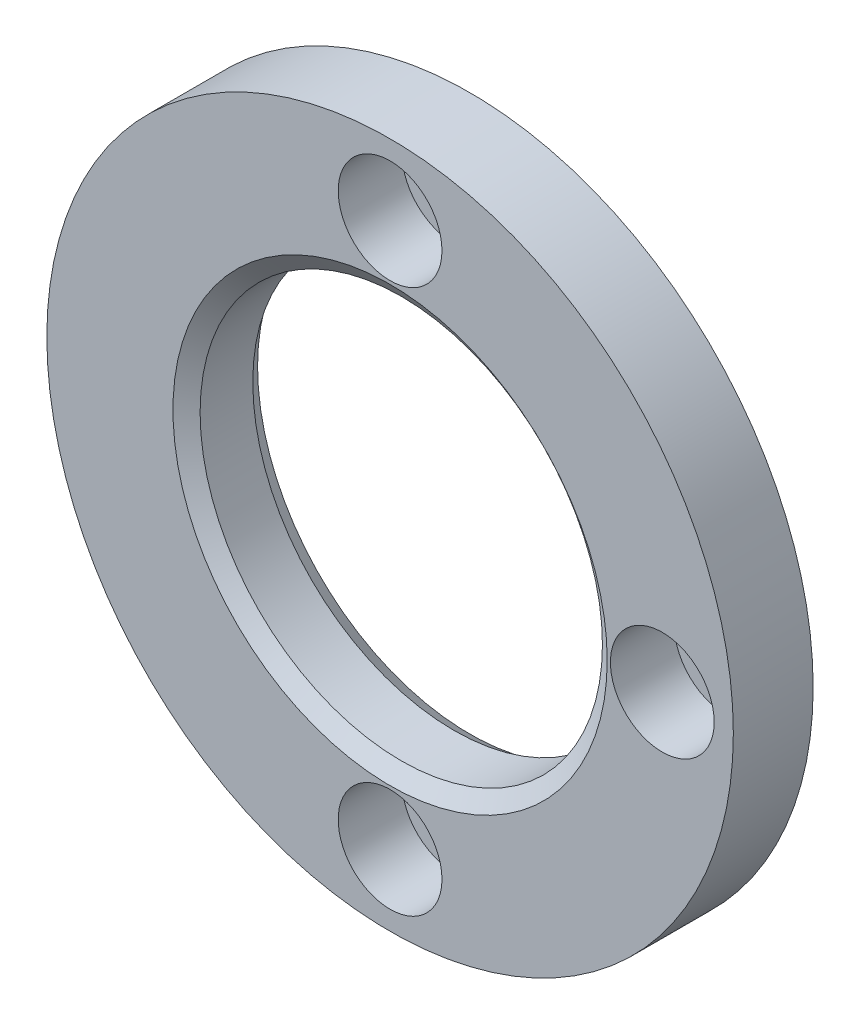
ISO-10303-21;
HEADER;
FILE_DESCRIPTION(('STEP AP214'),'2;1');
FILE_NAME('part.step','',(''),(''),'','','');
FILE_SCHEMA(('AUTOMOTIVE_DESIGN { 1 0 10303 214 1 1 1 1 }'));
ENDSEC;
DATA;
#1=APPLICATION_CONTEXT('core data for automotive mechanical design processes');
#2=APPLICATION_PROTOCOL_DEFINITION('international standard','automotive_design',2000,#1);
#3=PRODUCT_CONTEXT('',#1,'mechanical');
#4=PRODUCT('Part','Part','',(#3));
#5=PRODUCT_RELATED_PRODUCT_CATEGORY('part','',(#4));
#6=PRODUCT_DEFINITION_FORMATION('','',#4);
#7=PRODUCT_DEFINITION_CONTEXT('part definition',#1,'design');
#8=PRODUCT_DEFINITION('design','',#6,#7);
#9=PRODUCT_DEFINITION_SHAPE('','',#8);
#10=(LENGTH_UNIT() NAMED_UNIT(*) SI_UNIT(.MILLI.,.METRE.));
#11=(NAMED_UNIT(*) PLANE_ANGLE_UNIT() SI_UNIT($,.RADIAN.));
#12=(NAMED_UNIT(*) SI_UNIT($,.STERADIAN.) SOLID_ANGLE_UNIT());
#13=UNCERTAINTY_MEASURE_WITH_UNIT(LENGTH_MEASURE(1.E-05),#10,'distance_accuracy_value','');
#14=(GEOMETRIC_REPRESENTATION_CONTEXT(3) GLOBAL_UNCERTAINTY_ASSIGNED_CONTEXT((#13)) GLOBAL_UNIT_ASSIGNED_CONTEXT((#10,
#11,#12)) REPRESENTATION_CONTEXT('',''));
#15=CARTESIAN_POINT('',(0.,0.,0.));
#16=DIRECTION('',(0.,0.,1.));
#17=DIRECTION('',(1.,0.,0.));
#18=AXIS2_PLACEMENT_3D('',#15,#16,#17);
#19=CARTESIAN_POINT('',(93.,0.,10.));
#20=DIRECTION('',(0.,0.,1.));
#21=DIRECTION('',(1.,0.,0.));
#22=AXIS2_PLACEMENT_3D('',#19,#20,#21);
#23=PLANE('',#22);
#24=CARTESIAN_POINT('',(93.,0.,10.));
#25=DIRECTION('',(0.,0.,1.));
#26=DIRECTION('',(1.,0.,0.));
#27=AXIS2_PLACEMENT_3D('',#24,#25,#26);
#28=CIRCLE('',#27,27.2);
#29=CARTESIAN_POINT('',(120.2,0.,10.));
#30=VERTEX_POINT('',#29);
#31=EDGE_CURVE('E10',#30,#30,#28,.F.);
#32=ORIENTED_EDGE('',*,*,#31,.T.);
#33=EDGE_LOOP('',(#32));
#34=FACE_BOUND('',#33,.T.);
#35=CARTESIAN_POINT('',(127.1,0.,10.));
#36=DIRECTION('',(0.,0.,1.));
#37=DIRECTION('',(1.,0.,0.));
#38=AXIS2_PLACEMENT_3D('',#35,#36,#37);
#39=CIRCLE('',#38,6.50000000000002);
#40=CARTESIAN_POINT('',(133.6,0.,10.));
#41=VERTEX_POINT('',#40);
#42=EDGE_CURVE('E60',#41,#41,#39,.T.);
#43=ORIENTED_EDGE('',*,*,#42,.F.);
#44=EDGE_LOOP('',(#43));
#45=FACE_BOUND('',#44,.T.);
#46=CARTESIAN_POINT('',(93.,0.,10.));
#47=DIRECTION('',(0.,0.,1.));
#48=DIRECTION('',(1.,0.,0.));
#49=AXIS2_PLACEMENT_3D('',#46,#47,#48);
#50=CIRCLE('',#49,43.);
#51=CARTESIAN_POINT('',(136.,0.,10.));
#52=VERTEX_POINT('',#51);
#53=EDGE_CURVE('E50',#52,#52,#50,.T.);
#54=ORIENTED_EDGE('',*,*,#53,.T.);
#55=EDGE_LOOP('',(#54));
#56=FACE_BOUND('',#55,.T.);
#57=CARTESIAN_POINT('',(93.0000000000004,34.1000000000005,10.));
#58=DIRECTION('',(0.,0.,1.));
#59=DIRECTION('',(1.,0.,0.));
#60=AXIS2_PLACEMENT_3D('',#57,#58,#59);
#61=CIRCLE('',#60,6.49999999999999);
#62=CARTESIAN_POINT('',(99.5000000000004,34.1000000000005,10.));
#63=VERTEX_POINT('',#62);
#64=EDGE_CURVE('E54',#63,#63,#61,.T.);
#65=ORIENTED_EDGE('',*,*,#64,.F.);
#66=EDGE_LOOP('',(#65));
#67=FACE_BOUND('',#66,.T.);
#68=CARTESIAN_POINT('',(92.9999999999994,-34.0999999999995,10.));
#69=DIRECTION('',(0.,0.,1.));
#70=DIRECTION('',(1.,0.,0.));
#71=AXIS2_PLACEMENT_3D('',#68,#69,#70);
#72=CIRCLE('',#71,6.5);
#73=CARTESIAN_POINT('',(99.4999999999994,-34.0999999999995,10.));
#74=VERTEX_POINT('',#73);
#75=EDGE_CURVE('E66',#74,#74,#72,.T.);
#76=ORIENTED_EDGE('',*,*,#75,.F.);
#77=EDGE_LOOP('',(#76));
#78=FACE_BOUND('',#77,.T.);
#79=ADVANCED_FACE('F30',(#34,#45,#56,#67,#78),#23,.T.);
#80=CARTESIAN_POINT('',(93.,0.,0.));
#81=DIRECTION('',(0.,0.,1.));
#82=DIRECTION('',(1.,0.,0.));
#83=AXIS2_PLACEMENT_3D('',#80,#81,#82);
#84=PLANE('',#83);
#85=CARTESIAN_POINT('',(93.,0.,0.));
#86=DIRECTION('',(0.,0.,1.));
#87=DIRECTION('',(1.,0.,0.));
#88=AXIS2_PLACEMENT_3D('',#85,#86,#87);
#89=CIRCLE('',#88,26.6004150764194);
#90=CARTESIAN_POINT('',(119.600415076419,0.,0.));
#91=VERTEX_POINT('',#90);
#92=EDGE_CURVE('E45',#91,#91,#89,.T.);
#93=ORIENTED_EDGE('',*,*,#92,.T.);
#94=EDGE_LOOP('',(#93));
#95=FACE_BOUND('',#94,.T.);
#96=CARTESIAN_POINT('',(93.,0.,0.));
#97=DIRECTION('',(0.,0.,1.));
#98=DIRECTION('',(1.,0.,0.));
#99=AXIS2_PLACEMENT_3D('',#96,#97,#98);
#100=CIRCLE('',#99,43.);
#101=CARTESIAN_POINT('',(136.,0.,0.));
#102=VERTEX_POINT('',#101);
#103=EDGE_CURVE('E51',#102,#102,#100,.T.);
#104=ORIENTED_EDGE('',*,*,#103,.F.);
#105=EDGE_LOOP('',(#104));
#106=FACE_BOUND('',#105,.T.);
#107=ADVANCED_FACE('F79',(#95,#106),#84,.F.);
#108=CARTESIAN_POINT('',(93.,0.,10.));
#109=DIRECTION('',(0.,0.,-1.));
#110=DIRECTION('',(-1.,0.,0.));
#111=AXIS2_PLACEMENT_3D('',#108,#109,#110);
#112=CYLINDRICAL_SURFACE('',#111,43.);
#113=ORIENTED_EDGE('',*,*,#53,.F.);
#114=EDGE_LOOP('',(#113));
#115=FACE_BOUND('',#114,.T.);
#116=ORIENTED_EDGE('',*,*,#103,.T.);
#117=EDGE_LOOP('',(#116));
#118=FACE_BOUND('',#117,.T.);
#119=ADVANCED_FACE('F84',(#115,#118),#112,.T.);
#120=CARTESIAN_POINT('',(93.,0.,10.));
#121=DIRECTION('',(0.,0.,-1.));
#122=DIRECTION('',(-1.,0.,0.));
#123=AXIS2_PLACEMENT_3D('',#120,#121,#122);
#124=CYLINDRICAL_SURFACE('',#123,25.2);
#125=CARTESIAN_POINT('',(93.,0.,2.00000000000001));
#126=DIRECTION('',(0.,0.,1.));
#127=DIRECTION('',(1.,0.,0.));
#128=AXIS2_PLACEMENT_3D('',#125,#126,#127);
#129=CIRCLE('',#128,25.2);
#130=CARTESIAN_POINT('',(118.2,0.,2.00000000000001));
#131=VERTEX_POINT('',#130);
#132=EDGE_CURVE('E37',#131,#131,#129,.F.);
#133=ORIENTED_EDGE('',*,*,#132,.T.);
#134=EDGE_LOOP('',(#133));
#135=FACE_BOUND('',#134,.T.);
#136=CARTESIAN_POINT('',(93.,0.,8.59958492358056));
#137=DIRECTION('',(0.,0.,1.));
#138=DIRECTION('',(1.,0.,0.));
#139=AXIS2_PLACEMENT_3D('',#136,#137,#138);
#140=CIRCLE('',#139,25.2);
#141=CARTESIAN_POINT('',(118.2,0.,8.59958492358056));
#142=VERTEX_POINT('',#141);
#143=EDGE_CURVE('E41',#142,#142,#140,.T.);
#144=ORIENTED_EDGE('',*,*,#143,.T.);
#145=EDGE_LOOP('',(#144));
#146=FACE_BOUND('',#145,.T.);
#147=ADVANCED_FACE('F89',(#135,#146),#124,.F.);
#148=CARTESIAN_POINT('',(93.0000000000004,34.1000000000005,10.));
#149=DIRECTION('',(0.,0.,-1.));
#150=DIRECTION('',(-1.,0.,0.));
#151=AXIS2_PLACEMENT_3D('',#148,#149,#150);
#152=CYLINDRICAL_SURFACE('',#151,6.49999999999999);
#153=ORIENTED_EDGE('',*,*,#64,.T.);
#154=EDGE_LOOP('',(#153));
#155=FACE_BOUND('',#154,.T.);
#156=CARTESIAN_POINT('',(93.0000000000004,34.1000000000005,2.));
#157=DIRECTION('',(0.,0.,1.));
#158=DIRECTION('',(1.,0.,0.));
#159=AXIS2_PLACEMENT_3D('',#156,#157,#158);
#160=CIRCLE('',#159,6.49999999999999);
#161=CARTESIAN_POINT('',(99.5000000000004,34.1000000000005,2.));
#162=VERTEX_POINT('',#161);
#163=EDGE_CURVE('E57',#162,#162,#160,.T.);
#164=ORIENTED_EDGE('',*,*,#163,.F.);
#165=EDGE_LOOP('',(#164));
#166=FACE_BOUND('',#165,.T.);
#167=ADVANCED_FACE('F125',(#155,#166),#152,.F.);
#168=CARTESIAN_POINT('',(93.0000000000004,34.1000000000005,2.));
#169=DIRECTION('',(0.,0.,1.));
#170=DIRECTION('',(1.,0.,0.));
#171=AXIS2_PLACEMENT_3D('',#168,#169,#170);
#172=PLANE('',#171);
#173=ORIENTED_EDGE('',*,*,#163,.T.);
#174=EDGE_LOOP('',(#173));
#175=FACE_BOUND('',#174,.T.);
#176=ADVANCED_FACE('F122',(#175),#172,.T.);
#177=CARTESIAN_POINT('',(127.1,0.,10.));
#178=DIRECTION('',(0.,0.,-1.));
#179=DIRECTION('',(-1.,0.,0.));
#180=AXIS2_PLACEMENT_3D('',#177,#178,#179);
#181=CYLINDRICAL_SURFACE('',#180,6.50000000000002);
#182=ORIENTED_EDGE('',*,*,#42,.T.);
#183=EDGE_LOOP('',(#182));
#184=FACE_BOUND('',#183,.T.);
#185=CARTESIAN_POINT('',(127.1,0.,2.));
#186=DIRECTION('',(0.,0.,1.));
#187=DIRECTION('',(1.,0.,0.));
#188=AXIS2_PLACEMENT_3D('',#185,#186,#187);
#189=CIRCLE('',#188,6.50000000000002);
#190=CARTESIAN_POINT('',(133.6,0.,2.));
#191=VERTEX_POINT('',#190);
#192=EDGE_CURVE('E63',#191,#191,#189,.T.);
#193=ORIENTED_EDGE('',*,*,#192,.F.);
#194=EDGE_LOOP('',(#193));
#195=FACE_BOUND('',#194,.T.);
#196=ADVANCED_FACE('F118',(#184,#195),#181,.F.);
#197=CARTESIAN_POINT('',(127.1,0.,2.));
#198=DIRECTION('',(0.,0.,1.));
#199=DIRECTION('',(1.,0.,0.));
#200=AXIS2_PLACEMENT_3D('',#197,#198,#199);
#201=PLANE('',#200);
#202=ORIENTED_EDGE('',*,*,#192,.T.);
#203=EDGE_LOOP('',(#202));
#204=FACE_BOUND('',#203,.T.);
#205=ADVANCED_FACE('F113',(#204),#201,.T.);
#206=CARTESIAN_POINT('',(92.9999999999994,-34.0999999999995,10.));
#207=DIRECTION('',(0.,0.,-1.));
#208=DIRECTION('',(-1.,0.,0.));
#209=AXIS2_PLACEMENT_3D('',#206,#207,#208);
#210=CYLINDRICAL_SURFACE('',#209,6.5);
#211=ORIENTED_EDGE('',*,*,#75,.T.);
#212=EDGE_LOOP('',(#211));
#213=FACE_BOUND('',#212,.T.);
#214=CARTESIAN_POINT('',(92.9999999999994,-34.0999999999995,2.));
#215=DIRECTION('',(0.,0.,1.));
#216=DIRECTION('',(1.,0.,0.));
#217=AXIS2_PLACEMENT_3D('',#214,#215,#216);
#218=CIRCLE('',#217,6.5);
#219=CARTESIAN_POINT('',(99.4999999999994,-34.0999999999995,2.));
#220=VERTEX_POINT('',#219);
#221=EDGE_CURVE('E69',#220,#220,#218,.T.);
#222=ORIENTED_EDGE('',*,*,#221,.F.);
#223=EDGE_LOOP('',(#222));
#224=FACE_BOUND('',#223,.T.);
#225=ADVANCED_FACE('F75',(#213,#224),#210,.F.);
#226=CARTESIAN_POINT('',(92.9999999999994,-34.0999999999995,2.));
#227=DIRECTION('',(0.,0.,1.));
#228=DIRECTION('',(1.,0.,0.));
#229=AXIS2_PLACEMENT_3D('',#226,#227,#228);
#230=PLANE('',#229);
#231=ORIENTED_EDGE('',*,*,#221,.T.);
#232=EDGE_LOOP('',(#231));
#233=FACE_BOUND('',#232,.T.);
#234=ADVANCED_FACE('F96',(#233),#230,.T.);
#235=CARTESIAN_POINT('',(93.,0.,0.));
#236=DIRECTION('',(0.,0.,-1.));
#237=DIRECTION('',(-1.,0.,0.));
#238=AXIS2_PLACEMENT_3D('',#235,#236,#237);
#239=CONICAL_SURFACE('',#238,26.6004150764194,0.610865238198013);
#240=ORIENTED_EDGE('',*,*,#132,.F.);
#241=EDGE_LOOP('',(#240));
#242=FACE_BOUND('',#241,.T.);
#243=ORIENTED_EDGE('',*,*,#92,.F.);
#244=EDGE_LOOP('',(#243));
#245=FACE_BOUND('',#244,.T.);
#246=ADVANCED_FACE('F94',(#242,#245),#239,.F.);
#247=CARTESIAN_POINT('',(93.,0.,8.59958492358056));
#248=DIRECTION('',(0.,0.,1.));
#249=DIRECTION('',(1.,0.,0.));
#250=AXIS2_PLACEMENT_3D('',#247,#248,#249);
#251=CONICAL_SURFACE('',#250,25.2,0.959931088596878);
#252=ORIENTED_EDGE('',*,*,#31,.F.);
#253=EDGE_LOOP('',(#252));
#254=FACE_BOUND('',#253,.T.);
#255=ORIENTED_EDGE('',*,*,#143,.F.);
#256=EDGE_LOOP('',(#255));
#257=FACE_BOUND('',#256,.T.);
#258=ADVANCED_FACE('F32',(#254,#257),#251,.F.);
#259=CLOSED_SHELL('',(#79,#107,#119,#147,#167,#176,#196,#205,#225,#234,#246,#258));
#260=MANIFOLD_SOLID_BREP('B2',#259);
#261=ADVANCED_BREP_SHAPE_REPRESENTATION('',(#18,#260),#14);
#262=SHAPE_DEFINITION_REPRESENTATION(#9,#261);
ENDSEC;
END-ISO-10303-21;
